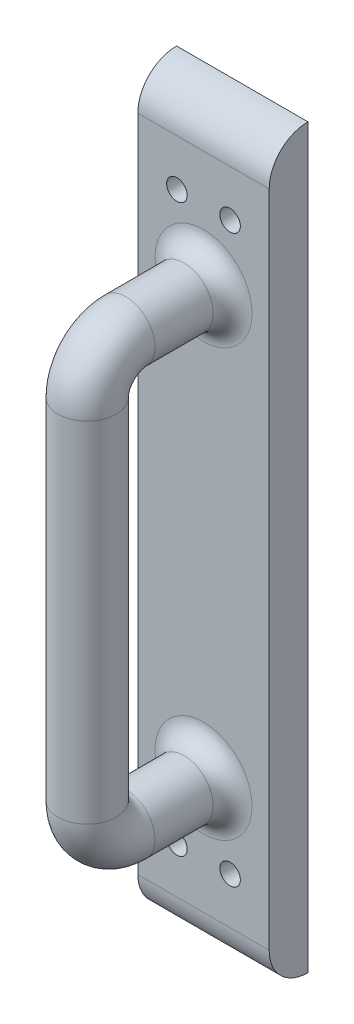
ISO-10303-21;
HEADER;
FILE_DESCRIPTION(('STEP AP214'),'2;1');
FILE_NAME('part.step','',(''),(''),'','','');
FILE_SCHEMA(('AUTOMOTIVE_DESIGN { 1 0 10303 214 1 1 1 1 }'));
ENDSEC;
DATA;
#1=APPLICATION_CONTEXT('core data for automotive mechanical design processes');
#2=APPLICATION_PROTOCOL_DEFINITION('international standard','automotive_design',2000,#1);
#3=PRODUCT_CONTEXT('',#1,'mechanical');
#4=PRODUCT('Part','Part','',(#3));
#5=PRODUCT_RELATED_PRODUCT_CATEGORY('part','',(#4));
#6=PRODUCT_DEFINITION_FORMATION('','',#4);
#7=PRODUCT_DEFINITION_CONTEXT('part definition',#1,'design');
#8=PRODUCT_DEFINITION('design','',#6,#7);
#9=PRODUCT_DEFINITION_SHAPE('','',#8);
#10=(LENGTH_UNIT() NAMED_UNIT(*) SI_UNIT(.MILLI.,.METRE.));
#11=(NAMED_UNIT(*) PLANE_ANGLE_UNIT() SI_UNIT($,.RADIAN.));
#12=(NAMED_UNIT(*) SI_UNIT($,.STERADIAN.) SOLID_ANGLE_UNIT());
#13=UNCERTAINTY_MEASURE_WITH_UNIT(LENGTH_MEASURE(1.E-05),#10,'distance_accuracy_value','');
#14=(GEOMETRIC_REPRESENTATION_CONTEXT(3) GLOBAL_UNCERTAINTY_ASSIGNED_CONTEXT((#13)) GLOBAL_UNIT_ASSIGNED_CONTEXT((#10,
#11,#12)) REPRESENTATION_CONTEXT('',''));
#15=CARTESIAN_POINT('',(0.,0.,0.));
#16=DIRECTION('',(0.,0.,1.));
#17=DIRECTION('',(1.,0.,0.));
#18=AXIS2_PLACEMENT_3D('',#15,#16,#17);
#19=CARTESIAN_POINT('',(0.,0.,10.));
#20=DIRECTION('',(0.,0.,-1.));
#21=DIRECTION('',(-1.,0.,0.));
#22=AXIS2_PLACEMENT_3D('',#19,#20,#21);
#23=PLANE('',#22);
#24=CARTESIAN_POINT('',(0.,-55.,10.));
#25=DIRECTION('',(0.,0.,-1.));
#26=DIRECTION('',(-1.,0.,0.));
#27=AXIS2_PLACEMENT_3D('',#24,#25,#26);
#28=CIRCLE('',#27,12.5);
#29=CARTESIAN_POINT('',(-12.5,-55.,10.));
#30=VERTEX_POINT('',#29);
#31=EDGE_CURVE('E126',#30,#30,#28,.T.);
#32=ORIENTED_EDGE('',*,*,#31,.T.);
#33=EDGE_LOOP('',(#32));
#34=FACE_BOUND('',#33,.T.);
#35=CARTESIAN_POINT('',(0.,55.,10.));
#36=DIRECTION('',(0.,0.,-1.));
#37=DIRECTION('',(-1.,0.,0.));
#38=AXIS2_PLACEMENT_3D('',#35,#36,#37);
#39=CIRCLE('',#38,12.5);
#40=CARTESIAN_POINT('',(-12.5,55.,10.));
#41=VERTEX_POINT('',#40);
#42=EDGE_CURVE('E122',#41,#41,#39,.T.);
#43=ORIENTED_EDGE('',*,*,#42,.T.);
#44=EDGE_LOOP('',(#43));
#45=FACE_BOUND('',#44,.T.);
#46=DIRECTION('',(0.,-1.,0.));
#47=VECTOR('',#46,1.);
#48=CARTESIAN_POINT('',(-16.9328045684474,-95.,10.));
#49=LINE('',#48,#47);
#50=CARTESIAN_POINT('',(-16.9328045684475,85.,10.));
#51=VERTEX_POINT('',#50);
#52=CARTESIAN_POINT('',(-16.9328045684474,-85.,10.));
#53=VERTEX_POINT('',#52);
#54=EDGE_CURVE('E148',#51,#53,#49,.T.);
#55=ORIENTED_EDGE('',*,*,#54,.T.);
#56=DIRECTION('',(1.,0.,0.));
#57=VECTOR('',#56,1.);
#58=CARTESIAN_POINT('',(0.,-85.,10.));
#59=LINE('',#58,#57);
#60=CARTESIAN_POINT('',(16.9328045684475,-85.,10.));
#61=VERTEX_POINT('',#60);
#62=EDGE_CURVE('E109',#53,#61,#59,.T.);
#63=ORIENTED_EDGE('',*,*,#62,.T.);
#64=DIRECTION('',(0.,1.,0.));
#65=VECTOR('',#64,1.);
#66=CARTESIAN_POINT('',(16.9328045684475,-95.,10.));
#67=LINE('',#66,#65);
#68=CARTESIAN_POINT('',(16.9328045684475,85.,10.));
#69=VERTEX_POINT('',#68);
#70=EDGE_CURVE('E193',#61,#69,#67,.T.);
#71=ORIENTED_EDGE('',*,*,#70,.T.);
#72=DIRECTION('',(-1.,0.,0.));
#73=VECTOR('',#72,1.);
#74=CARTESIAN_POINT('',(0.,85.,10.));
#75=LINE('',#74,#73);
#76=EDGE_CURVE('E107',#69,#51,#75,.T.);
#77=ORIENTED_EDGE('',*,*,#76,.T.);
#78=EDGE_LOOP('',(#55,#63,#71,#77));
#79=FACE_BOUND('',#78,.T.);
#80=CARTESIAN_POINT('',(-6.85,73.,10.));
#81=DIRECTION('',(0.,0.,1.));
#82=DIRECTION('',(1.,0.,0.));
#83=AXIS2_PLACEMENT_3D('',#80,#81,#82);
#84=CIRCLE('',#83,2.65);
#85=CARTESIAN_POINT('',(-4.2,73.,10.));
#86=VERTEX_POINT('',#85);
#87=EDGE_CURVE('E104',#86,#86,#84,.T.);
#88=ORIENTED_EDGE('',*,*,#87,.F.);
#89=EDGE_LOOP('',(#88));
#90=FACE_BOUND('',#89,.T.);
#91=CARTESIAN_POINT('',(6.85,73.,10.));
#92=DIRECTION('',(0.,0.,1.));
#93=DIRECTION('',(-1.,0.,0.));
#94=AXIS2_PLACEMENT_3D('',#91,#92,#93);
#95=CIRCLE('',#94,2.65);
#96=CARTESIAN_POINT('',(4.2,73.,10.));
#97=VERTEX_POINT('',#96);
#98=EDGE_CURVE('E156',#97,#97,#95,.T.);
#99=ORIENTED_EDGE('',*,*,#98,.F.);
#100=EDGE_LOOP('',(#99));
#101=FACE_BOUND('',#100,.T.);
#102=CARTESIAN_POINT('',(-6.85,-73.,10.));
#103=DIRECTION('',(0.,0.,1.));
#104=DIRECTION('',(-1.,0.,0.));
#105=AXIS2_PLACEMENT_3D('',#102,#103,#104);
#106=CIRCLE('',#105,2.65000000000001);
#107=CARTESIAN_POINT('',(-9.50000000000001,-73.,10.));
#108=VERTEX_POINT('',#107);
#109=EDGE_CURVE('E160',#108,#108,#106,.T.);
#110=ORIENTED_EDGE('',*,*,#109,.F.);
#111=EDGE_LOOP('',(#110));
#112=FACE_BOUND('',#111,.T.);
#113=CARTESIAN_POINT('',(6.85,-73.,10.));
#114=DIRECTION('',(0.,0.,1.));
#115=DIRECTION('',(1.,0.,0.));
#116=AXIS2_PLACEMENT_3D('',#113,#114,#115);
#117=CIRCLE('',#116,2.65000000000001);
#118=CARTESIAN_POINT('',(9.50000000000001,-73.,10.));
#119=VERTEX_POINT('',#118);
#120=EDGE_CURVE('E163',#119,#119,#117,.T.);
#121=ORIENTED_EDGE('',*,*,#120,.F.);
#122=EDGE_LOOP('',(#121));
#123=FACE_BOUND('',#122,.T.);
#124=ADVANCED_FACE('F42',(#34,#45,#79,#90,#101,#112,#123),#23,.F.);
#125=CARTESIAN_POINT('',(0.,0.,0.));
#126=DIRECTION('',(0.,0.,-1.));
#127=DIRECTION('',(-1.,0.,0.));
#128=AXIS2_PLACEMENT_3D('',#125,#126,#127);
#129=PLANE('',#128);
#130=CARTESIAN_POINT('',(-6.85,-73.,0.));
#131=DIRECTION('',(0.,0.,1.));
#132=DIRECTION('',(-1.,0.,0.));
#133=AXIS2_PLACEMENT_3D('',#130,#131,#132);
#134=CIRCLE('',#133,2.65000000000001);
#135=CARTESIAN_POINT('',(-9.50000000000001,-73.,0.));
#136=VERTEX_POINT('',#135);
#137=EDGE_CURVE('E166',#136,#136,#134,.T.);
#138=ORIENTED_EDGE('',*,*,#137,.T.);
#139=EDGE_LOOP('',(#138));
#140=FACE_BOUND('',#139,.T.);
#141=CARTESIAN_POINT('',(-6.85,73.,0.));
#142=DIRECTION('',(0.,0.,1.));
#143=DIRECTION('',(1.,0.,0.));
#144=AXIS2_PLACEMENT_3D('',#141,#142,#143);
#145=CIRCLE('',#144,2.65);
#146=CARTESIAN_POINT('',(-4.2,73.,0.));
#147=VERTEX_POINT('',#146);
#148=EDGE_CURVE('E184',#147,#147,#145,.T.);
#149=ORIENTED_EDGE('',*,*,#148,.T.);
#150=EDGE_LOOP('',(#149));
#151=FACE_BOUND('',#150,.T.);
#152=DIRECTION('',(0.,1.,0.));
#153=VECTOR('',#152,1.);
#154=CARTESIAN_POINT('',(16.9328045684475,-95.,0.));
#155=LINE('',#154,#153);
#156=CARTESIAN_POINT('',(16.9328045684475,-95.,0.));
#157=VERTEX_POINT('',#156);
#158=CARTESIAN_POINT('',(16.9328045684475,95.,0.));
#159=VERTEX_POINT('',#158);
#160=EDGE_CURVE('E91',#157,#159,#155,.T.);
#161=ORIENTED_EDGE('',*,*,#160,.F.);
#162=DIRECTION('',(1.,0.,0.));
#163=VECTOR('',#162,1.);
#164=CARTESIAN_POINT('',(-16.9328045684474,-95.,0.));
#165=LINE('',#164,#163);
#166=CARTESIAN_POINT('',(-16.9328045684474,-95.,0.));
#167=VERTEX_POINT('',#166);
#168=EDGE_CURVE('E196',#167,#157,#165,.T.);
#169=ORIENTED_EDGE('',*,*,#168,.F.);
#170=DIRECTION('',(0.,-1.,0.));
#171=VECTOR('',#170,1.);
#172=CARTESIAN_POINT('',(-16.9328045684474,-95.,0.));
#173=LINE('',#172,#171);
#174=CARTESIAN_POINT('',(-16.9328045684475,95.,0.));
#175=VERTEX_POINT('',#174);
#176=EDGE_CURVE('E93',#175,#167,#173,.T.);
#177=ORIENTED_EDGE('',*,*,#176,.F.);
#178=DIRECTION('',(-1.,0.,0.));
#179=VECTOR('',#178,1.);
#180=CARTESIAN_POINT('',(-16.9328045684475,95.,0.));
#181=LINE('',#180,#179);
#182=EDGE_CURVE('E86',#159,#175,#181,.T.);
#183=ORIENTED_EDGE('',*,*,#182,.F.);
#184=EDGE_LOOP('',(#161,#169,#177,#183));
#185=FACE_BOUND('',#184,.T.);
#186=CARTESIAN_POINT('',(6.85,73.,0.));
#187=DIRECTION('',(0.,0.,1.));
#188=DIRECTION('',(-1.,0.,0.));
#189=AXIS2_PLACEMENT_3D('',#186,#187,#188);
#190=CIRCLE('',#189,2.65);
#191=CARTESIAN_POINT('',(4.2,73.,0.));
#192=VERTEX_POINT('',#191);
#193=EDGE_CURVE('E180',#192,#192,#190,.T.);
#194=ORIENTED_EDGE('',*,*,#193,.T.);
#195=EDGE_LOOP('',(#194));
#196=FACE_BOUND('',#195,.T.);
#197=CARTESIAN_POINT('',(6.85,-73.,0.));
#198=DIRECTION('',(0.,0.,1.));
#199=DIRECTION('',(1.,0.,0.));
#200=AXIS2_PLACEMENT_3D('',#197,#198,#199);
#201=CIRCLE('',#200,2.65000000000001);
#202=CARTESIAN_POINT('',(9.50000000000001,-73.,0.));
#203=VERTEX_POINT('',#202);
#204=EDGE_CURVE('E167',#203,#203,#201,.T.);
#205=ORIENTED_EDGE('',*,*,#204,.T.);
#206=EDGE_LOOP('',(#205));
#207=FACE_BOUND('',#206,.T.);
#208=ADVANCED_FACE('F88',(#140,#151,#185,#196,#207),#129,.T.);
#209=CARTESIAN_POINT('',(16.9328045684475,-95.,10.));
#210=DIRECTION('',(-1.,0.,0.));
#211=DIRECTION('',(0.,0.,1.));
#212=AXIS2_PLACEMENT_3D('',#209,#210,#211);
#213=PLANE('',#212);
#214=ORIENTED_EDGE('',*,*,#70,.F.);
#215=CARTESIAN_POINT('',(16.9328045684475,-85.,0.));
#216=DIRECTION('',(-1.,0.,0.));
#217=DIRECTION('',(0.,0.,1.));
#218=AXIS2_PLACEMENT_3D('',#215,#216,#217);
#219=CIRCLE('',#218,10.);
#220=EDGE_CURVE('E102',#61,#157,#219,.F.);
#221=ORIENTED_EDGE('',*,*,#220,.T.);
#222=ORIENTED_EDGE('',*,*,#160,.T.);
#223=CARTESIAN_POINT('',(16.9328045684475,85.,0.));
#224=DIRECTION('',(-1.,0.,0.));
#225=DIRECTION('',(0.,0.,1.));
#226=AXIS2_PLACEMENT_3D('',#223,#224,#225);
#227=CIRCLE('',#226,10.);
#228=EDGE_CURVE('E100',#159,#69,#227,.F.);
#229=ORIENTED_EDGE('',*,*,#228,.T.);
#230=EDGE_LOOP('',(#214,#221,#222,#229));
#231=FACE_BOUND('',#230,.T.);
#232=ADVANCED_FACE('F99',(#231),#213,.F.);
#233=CARTESIAN_POINT('',(-16.9328045684474,-95.,10.));
#234=DIRECTION('',(1.,0.,0.));
#235=DIRECTION('',(0.,1.,0.));
#236=AXIS2_PLACEMENT_3D('',#233,#234,#235);
#237=PLANE('',#236);
#238=ORIENTED_EDGE('',*,*,#176,.T.);
#239=CARTESIAN_POINT('',(-16.9328045684474,-85.,0.));
#240=DIRECTION('',(1.,0.,0.));
#241=DIRECTION('',(0.,1.,0.));
#242=AXIS2_PLACEMENT_3D('',#239,#240,#241);
#243=CIRCLE('',#242,10.);
#244=EDGE_CURVE('E58',#167,#53,#243,.F.);
#245=ORIENTED_EDGE('',*,*,#244,.T.);
#246=ORIENTED_EDGE('',*,*,#54,.F.);
#247=CARTESIAN_POINT('',(-16.9328045684475,85.,0.));
#248=DIRECTION('',(1.,0.,0.));
#249=DIRECTION('',(0.,1.,0.));
#250=AXIS2_PLACEMENT_3D('',#247,#248,#249);
#251=CIRCLE('',#250,10.);
#252=EDGE_CURVE('E66',#51,#175,#251,.F.);
#253=ORIENTED_EDGE('',*,*,#252,.T.);
#254=EDGE_LOOP('',(#238,#245,#246,#253));
#255=FACE_BOUND('',#254,.T.);
#256=ADVANCED_FACE('F203',(#255),#237,.F.);
#257=CARTESIAN_POINT('',(-6.85,73.,10.));
#258=DIRECTION('',(0.,0.,-1.));
#259=DIRECTION('',(-1.,0.,0.));
#260=AXIS2_PLACEMENT_3D('',#257,#258,#259);
#261=CYLINDRICAL_SURFACE('',#260,2.65);
#262=ORIENTED_EDGE('',*,*,#87,.T.);
#263=EDGE_LOOP('',(#262));
#264=FACE_BOUND('',#263,.T.);
#265=ORIENTED_EDGE('',*,*,#148,.F.);
#266=EDGE_LOOP('',(#265));
#267=FACE_BOUND('',#266,.T.);
#268=ADVANCED_FACE('F221',(#264,#267),#261,.F.);
#269=CARTESIAN_POINT('',(6.85,73.,10.));
#270=DIRECTION('',(0.,0.,-1.));
#271=DIRECTION('',(-1.,0.,0.));
#272=AXIS2_PLACEMENT_3D('',#269,#270,#271);
#273=CYLINDRICAL_SURFACE('',#272,2.65);
#274=ORIENTED_EDGE('',*,*,#98,.T.);
#275=EDGE_LOOP('',(#274));
#276=FACE_BOUND('',#275,.T.);
#277=ORIENTED_EDGE('',*,*,#193,.F.);
#278=EDGE_LOOP('',(#277));
#279=FACE_BOUND('',#278,.T.);
#280=ADVANCED_FACE('F227',(#276,#279),#273,.F.);
#281=CARTESIAN_POINT('',(-6.85,-73.,10.));
#282=DIRECTION('',(0.,0.,-1.));
#283=DIRECTION('',(-1.,0.,0.));
#284=AXIS2_PLACEMENT_3D('',#281,#282,#283);
#285=CYLINDRICAL_SURFACE('',#284,2.65000000000001);
#286=ORIENTED_EDGE('',*,*,#109,.T.);
#287=EDGE_LOOP('',(#286));
#288=FACE_BOUND('',#287,.T.);
#289=ORIENTED_EDGE('',*,*,#137,.F.);
#290=EDGE_LOOP('',(#289));
#291=FACE_BOUND('',#290,.T.);
#292=ADVANCED_FACE('F214',(#288,#291),#285,.F.);
#293=CARTESIAN_POINT('',(6.85,-73.,10.));
#294=DIRECTION('',(0.,0.,-1.));
#295=DIRECTION('',(-1.,0.,0.));
#296=AXIS2_PLACEMENT_3D('',#293,#294,#295);
#297=CYLINDRICAL_SURFACE('',#296,2.65000000000001);
#298=ORIENTED_EDGE('',*,*,#120,.T.);
#299=EDGE_LOOP('',(#298));
#300=FACE_BOUND('',#299,.T.);
#301=ORIENTED_EDGE('',*,*,#204,.F.);
#302=EDGE_LOOP('',(#301));
#303=FACE_BOUND('',#302,.T.);
#304=ADVANCED_FACE('F207',(#300,#303),#297,.F.);
#305=CARTESIAN_POINT('',(0.,-85.,0.));
#306=DIRECTION('',(1.,0.,0.));
#307=DIRECTION('',(0.,0.,-1.));
#308=AXIS2_PLACEMENT_3D('',#305,#306,#307);
#309=CYLINDRICAL_SURFACE('',#308,10.);
#310=ORIENTED_EDGE('',*,*,#244,.F.);
#311=ORIENTED_EDGE('',*,*,#168,.T.);
#312=ORIENTED_EDGE('',*,*,#220,.F.);
#313=ORIENTED_EDGE('',*,*,#62,.F.);
#314=EDGE_LOOP('',(#310,#311,#312,#313));
#315=FACE_BOUND('',#314,.T.);
#316=ADVANCED_FACE('F205',(#315),#309,.T.);
#317=CARTESIAN_POINT('',(0.,85.,0.));
#318=DIRECTION('',(-1.,0.,0.));
#319=DIRECTION('',(0.,0.,1.));
#320=AXIS2_PLACEMENT_3D('',#317,#318,#319);
#321=CYLINDRICAL_SURFACE('',#320,10.);
#322=ORIENTED_EDGE('',*,*,#228,.F.);
#323=ORIENTED_EDGE('',*,*,#182,.T.);
#324=ORIENTED_EDGE('',*,*,#252,.F.);
#325=ORIENTED_EDGE('',*,*,#76,.F.);
#326=EDGE_LOOP('',(#322,#323,#324,#325));
#327=FACE_BOUND('',#326,.T.);
#328=ADVANCED_FACE('F106',(#327),#321,.T.);
#329=CARTESIAN_POINT('',(0.,55.,10.));
#330=DIRECTION('',(0.,0.,1.));
#331=DIRECTION('',(1.,0.,0.));
#332=AXIS2_PLACEMENT_3D('',#329,#330,#331);
#333=CYLINDRICAL_SURFACE('',#332,7.5);
#334=CARTESIAN_POINT('',(0.,55.,15.));
#335=DIRECTION('',(0.,0.,-1.));
#336=DIRECTION('',(-1.,0.,0.));
#337=AXIS2_PLACEMENT_3D('',#334,#335,#336);
#338=CIRCLE('',#337,7.5);
#339=CARTESIAN_POINT('',(-7.49999999999999,55.,15.));
#340=VERTEX_POINT('',#339);
#341=EDGE_CURVE('E11',#340,#340,#338,.F.);
#342=ORIENTED_EDGE('',*,*,#341,.T.);
#343=EDGE_LOOP('',(#342));
#344=FACE_BOUND('',#343,.T.);
#345=CARTESIAN_POINT('',(0.,55.,30.));
#346=DIRECTION('',(0.,0.,1.));
#347=DIRECTION('',(1.,0.,0.));
#348=AXIS2_PLACEMENT_3D('',#345,#346,#347);
#349=CIRCLE('',#348,7.5);
#350=CARTESIAN_POINT('',(0.,62.5,30.));
#351=VERTEX_POINT('',#350);
#352=EDGE_CURVE('E257',#351,#351,#349,.T.);
#353=ORIENTED_EDGE('',*,*,#352,.F.);
#354=EDGE_LOOP('',(#353));
#355=FACE_BOUND('',#354,.T.);
#356=ADVANCED_FACE('F139',(#344,#355),#333,.T.);
#357=CARTESIAN_POINT('',(0.,45.,30.));
#358=DIRECTION('',(1.,0.,0.));
#359=DIRECTION('',(0.,0.,-1.));
#360=AXIS2_PLACEMENT_3D('',#357,#358,#359);
#361=TOROIDAL_SURFACE('',#360,10.,7.5);
#362=CARTESIAN_POINT('',(0.,45.,40.));
#363=DIRECTION('',(0.,-1.,0.));
#364=DIRECTION('',(1.,0.,0.));
#365=AXIS2_PLACEMENT_3D('',#362,#363,#364);
#366=CIRCLE('',#365,7.5);
#367=CARTESIAN_POINT('',(0.,45.,47.5));
#368=VERTEX_POINT('',#367);
#369=EDGE_CURVE('E260',#368,#368,#366,.T.);
#370=CARTESIAN_POINT('',(0.,45.,30.));
#371=DIRECTION('',(1.,0.,0.));
#372=DIRECTION('',(0.,0.,-1.));
#373=AXIS2_PLACEMENT_3D('',#370,#371,#372);
#374=CIRCLE('',#373,17.5);
#375=EDGE_CURVE('',#351,#368,#374,.T.);
#376=ORIENTED_EDGE('',*,*,#352,.T.);
#377=ORIENTED_EDGE('',*,*,#369,.F.);
#378=ORIENTED_EDGE('',*,*,#375,.T.);
#379=ORIENTED_EDGE('',*,*,#375,.F.);
#380=EDGE_LOOP('',(#376,#378,#377,#379));
#381=FACE_BOUND('',#380,.T.);
#382=ADVANCED_FACE('F244',(#381),#361,.T.);
#383=CARTESIAN_POINT('',(0.,45.,40.));
#384=DIRECTION('',(0.,-1.,0.));
#385=DIRECTION('',(0.,0.,-1.));
#386=AXIS2_PLACEMENT_3D('',#383,#384,#385);
#387=CYLINDRICAL_SURFACE('',#386,7.5);
#388=CARTESIAN_POINT('',(0.,-45.,40.));
#389=DIRECTION('',(0.,-1.,0.));
#390=DIRECTION('',(1.,0.,0.));
#391=AXIS2_PLACEMENT_3D('',#388,#389,#390);
#392=CIRCLE('',#391,7.5);
#393=CARTESIAN_POINT('',(0.,-44.9999999999999,47.5));
#394=VERTEX_POINT('',#393);
#395=EDGE_CURVE('E264',#394,#394,#392,.T.);
#396=ORIENTED_EDGE('',*,*,#395,.F.);
#397=EDGE_LOOP('',(#396));
#398=FACE_BOUND('',#397,.T.);
#399=ORIENTED_EDGE('',*,*,#369,.T.);
#400=EDGE_LOOP('',(#399));
#401=FACE_BOUND('',#400,.T.);
#402=ADVANCED_FACE('F240',(#398,#401),#387,.T.);
#403=CARTESIAN_POINT('',(0.,-45.,30.));
#404=DIRECTION('',(1.,0.,0.));
#405=DIRECTION('',(0.,0.,-1.));
#406=AXIS2_PLACEMENT_3D('',#403,#404,#405);
#407=TOROIDAL_SURFACE('',#406,10.,7.5);
#408=CARTESIAN_POINT('',(0.,-55.,30.));
#409=DIRECTION('',(0.,0.,-1.));
#410=DIRECTION('',(1.,0.,0.));
#411=AXIS2_PLACEMENT_3D('',#408,#409,#410);
#412=CIRCLE('',#411,7.5);
#413=CARTESIAN_POINT('',(0.,-62.5,30.));
#414=VERTEX_POINT('',#413);
#415=EDGE_CURVE('E174',#414,#414,#412,.T.);
#416=CARTESIAN_POINT('',(0.,-45.,30.));
#417=DIRECTION('',(1.,0.,0.));
#418=DIRECTION('',(0.,0.,-1.));
#419=AXIS2_PLACEMENT_3D('',#416,#417,#418);
#420=CIRCLE('',#419,17.5);
#421=EDGE_CURVE('',#394,#414,#420,.T.);
#422=ORIENTED_EDGE('',*,*,#395,.T.);
#423=ORIENTED_EDGE('',*,*,#415,.F.);
#424=ORIENTED_EDGE('',*,*,#421,.T.);
#425=ORIENTED_EDGE('',*,*,#421,.F.);
#426=EDGE_LOOP('',(#422,#424,#423,#425));
#427=FACE_BOUND('',#426,.T.);
#428=ADVANCED_FACE('F237',(#427),#407,.T.);
#429=CARTESIAN_POINT('',(0.,-55.,30.));
#430=DIRECTION('',(0.,0.,-1.));
#431=DIRECTION('',(0.,1.,0.));
#432=AXIS2_PLACEMENT_3D('',#429,#430,#431);
#433=CYLINDRICAL_SURFACE('',#432,7.5);
#434=CARTESIAN_POINT('',(0.,-55.,15.));
#435=DIRECTION('',(0.,0.,-1.));
#436=DIRECTION('',(-1.,0.,0.));
#437=AXIS2_PLACEMENT_3D('',#434,#435,#436);
#438=CIRCLE('',#437,7.5);
#439=CARTESIAN_POINT('',(-7.49999999999998,-55.,15.));
#440=VERTEX_POINT('',#439);
#441=EDGE_CURVE('E51',#440,#440,#438,.F.);
#442=ORIENTED_EDGE('',*,*,#441,.T.);
#443=EDGE_LOOP('',(#442));
#444=FACE_BOUND('',#443,.T.);
#445=ORIENTED_EDGE('',*,*,#415,.T.);
#446=EDGE_LOOP('',(#445));
#447=FACE_BOUND('',#446,.T.);
#448=ADVANCED_FACE('F133',(#444,#447),#433,.T.);
#449=CARTESIAN_POINT('',(0.,-55.,15.));
#450=DIRECTION('',(0.,0.,-1.));
#451=DIRECTION('',(-1.,0.,0.));
#452=AXIS2_PLACEMENT_3D('',#449,#450,#451);
#453=TOROIDAL_SURFACE('',#452,12.5,5.);
#454=ORIENTED_EDGE('',*,*,#441,.F.);
#455=EDGE_LOOP('',(#454));
#456=FACE_BOUND('',#455,.T.);
#457=ORIENTED_EDGE('',*,*,#31,.F.);
#458=EDGE_LOOP('',(#457));
#459=FACE_BOUND('',#458,.T.);
#460=ADVANCED_FACE('F136',(#456,#459),#453,.F.);
#461=CARTESIAN_POINT('',(0.,55.,15.));
#462=DIRECTION('',(0.,0.,-1.));
#463=DIRECTION('',(-1.,0.,0.));
#464=AXIS2_PLACEMENT_3D('',#461,#462,#463);
#465=TOROIDAL_SURFACE('',#464,12.5,5.);
#466=ORIENTED_EDGE('',*,*,#42,.F.);
#467=EDGE_LOOP('',(#466));
#468=FACE_BOUND('',#467,.T.);
#469=ORIENTED_EDGE('',*,*,#341,.F.);
#470=EDGE_LOOP('',(#469));
#471=FACE_BOUND('',#470,.T.);
#472=ADVANCED_FACE('F44',(#468,#471),#465,.F.);
#473=CLOSED_SHELL('',(#124,#208,#232,#256,#268,#280,#292,#304,#316,#328,#356,#382,#402,#428,
#448,#460,#472));
#474=MANIFOLD_SOLID_BREP('B2',#473);
#475=ADVANCED_BREP_SHAPE_REPRESENTATION('',(#18,#474),#14);
#476=SHAPE_DEFINITION_REPRESENTATION(#9,#475);
ENDSEC;
END-ISO-10303-21;
